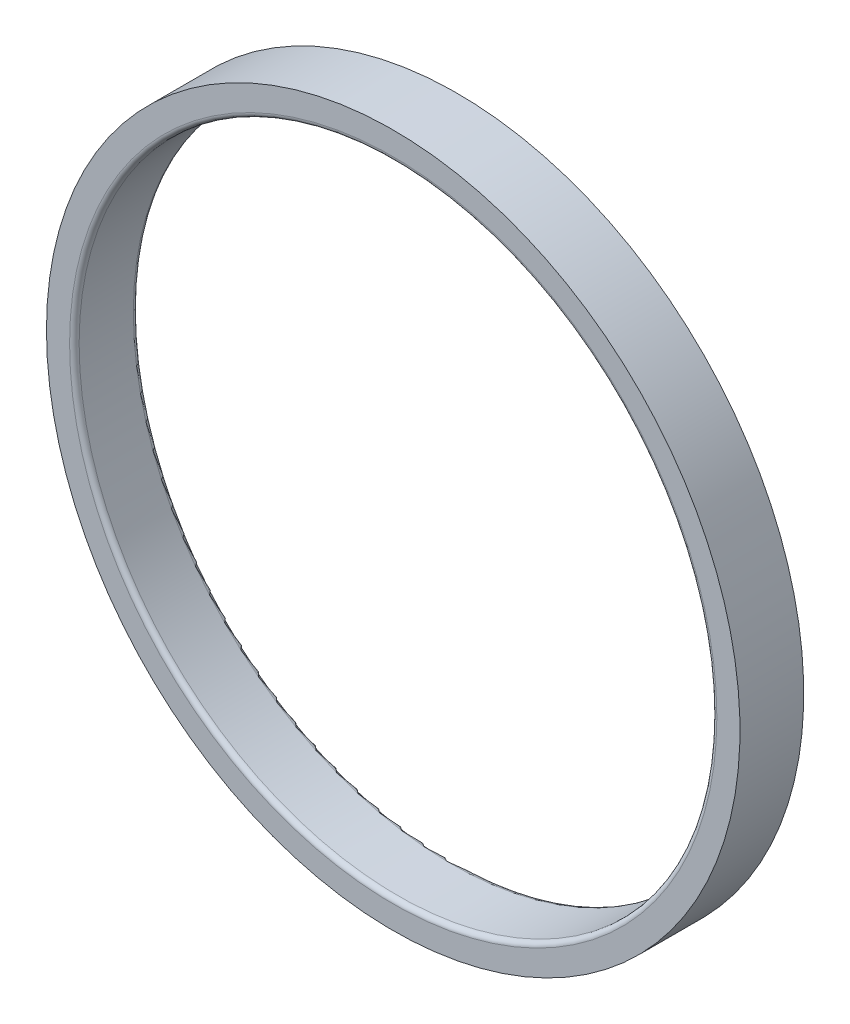
ISO-10303-21;
HEADER;
FILE_DESCRIPTION(('STEP AP214'),'2;1');
FILE_NAME('part.step','',(''),(''),'','','');
FILE_SCHEMA(('AUTOMOTIVE_DESIGN { 1 0 10303 214 1 1 1 1 }'));
ENDSEC;
DATA;
#1=APPLICATION_CONTEXT('core data for automotive mechanical design processes');
#2=APPLICATION_PROTOCOL_DEFINITION('international standard','automotive_design',2000,#1);
#3=PRODUCT_CONTEXT('',#1,'mechanical');
#4=PRODUCT('Part','Part','',(#3));
#5=PRODUCT_RELATED_PRODUCT_CATEGORY('part','',(#4));
#6=PRODUCT_DEFINITION_FORMATION('','',#4);
#7=PRODUCT_DEFINITION_CONTEXT('part definition',#1,'design');
#8=PRODUCT_DEFINITION('design','',#6,#7);
#9=PRODUCT_DEFINITION_SHAPE('','',#8);
#10=(LENGTH_UNIT() NAMED_UNIT(*) SI_UNIT(.MILLI.,.METRE.));
#11=(NAMED_UNIT(*) PLANE_ANGLE_UNIT() SI_UNIT($,.RADIAN.));
#12=(NAMED_UNIT(*) SI_UNIT($,.STERADIAN.) SOLID_ANGLE_UNIT());
#13=UNCERTAINTY_MEASURE_WITH_UNIT(LENGTH_MEASURE(1.E-05),#10,'distance_accuracy_value','');
#14=(GEOMETRIC_REPRESENTATION_CONTEXT(3) GLOBAL_UNCERTAINTY_ASSIGNED_CONTEXT((#13)) GLOBAL_UNIT_ASSIGNED_CONTEXT((#10,
#11,#12)) REPRESENTATION_CONTEXT('',''));
#15=CARTESIAN_POINT('',(0.,0.,0.));
#16=DIRECTION('',(0.,0.,1.));
#17=DIRECTION('',(1.,0.,0.));
#18=AXIS2_PLACEMENT_3D('',#15,#16,#17);
#19=CARTESIAN_POINT('',(0.,0.,63.1));
#20=DIRECTION('',(0.,0.,1.));
#21=DIRECTION('',(1.,0.,0.));
#22=AXIS2_PLACEMENT_3D('',#19,#20,#21);
#23=TOROIDAL_SURFACE('',#22,40.6,0.6);
#24=CARTESIAN_POINT('',(0.,0.,62.5));
#25=DIRECTION('',(0.,0.,-1.));
#26=DIRECTION('',(1.,0.,0.));
#27=AXIS2_PLACEMENT_3D('',#24,#25,#26);
#28=CIRCLE('',#27,40.6);
#29=CARTESIAN_POINT('',(-40.6,0.,62.5));
#30=VERTEX_POINT('',#29);
#31=EDGE_CURVE('E11',#30,#30,#28,.T.);
#32=ORIENTED_EDGE('',*,*,#31,.T.);
#33=CARTESIAN_POINT('',(-40.6,0.,63.1));
#34=DIRECTION('',(0.,-1.,0.));
#35=DIRECTION('',(-1.,0.,0.));
#36=AXIS2_PLACEMENT_3D('',#33,#34,#35);
#37=CIRCLE('',#36,0.6);
#38=CARTESIAN_POINT('',(-40.,0.,63.1));
#39=VERTEX_POINT('',#38);
#40=EDGE_CURVE('E27',#30,#39,#37,.T.);
#41=ORIENTED_EDGE('',*,*,#40,.T.);
#42=CARTESIAN_POINT('',(0.,0.,63.1));
#43=DIRECTION('',(0.,0.,1.));
#44=DIRECTION('',(1.,0.,0.));
#45=AXIS2_PLACEMENT_3D('',#42,#43,#44);
#46=CIRCLE('',#45,40.);
#47=EDGE_CURVE('E84',#39,#39,#46,.T.);
#48=ORIENTED_EDGE('',*,*,#47,.T.);
#49=ORIENTED_EDGE('',*,*,#40,.F.);
#50=EDGE_LOOP('',(#32,#41,#48,#49));
#51=FACE_BOUND('',#50,.T.);
#52=ADVANCED_FACE('F16',(#51),#23,.T.);
#53=CARTESIAN_POINT('',(0.,0.,66.5));
#54=DIRECTION('',(0.,0.,1.));
#55=DIRECTION('',(1.,0.,0.));
#56=AXIS2_PLACEMENT_3D('',#53,#54,#55);
#57=CYLINDRICAL_SURFACE('',#56,40.);
#58=CARTESIAN_POINT('',(0.,0.,69.9));
#59=DIRECTION('',(0.,0.,-1.));
#60=DIRECTION('',(1.,0.,0.));
#61=AXIS2_PLACEMENT_3D('',#58,#59,#60);
#62=CIRCLE('',#61,40.);
#63=CARTESIAN_POINT('',(-40.,0.,69.9));
#64=VERTEX_POINT('',#63);
#65=CARTESIAN_POINT('',(40.,0.,69.9));
#66=VERTEX_POINT('',#65);
#67=EDGE_CURVE('E90',#64,#66,#62,.T.);
#68=ORIENTED_EDGE('',*,*,#67,.F.);
#69=DIRECTION('',(0.,0.,-1.));
#70=VECTOR('',#69,1.);
#71=CARTESIAN_POINT('',(-40.,0.,66.5));
#72=LINE('',#71,#70);
#73=EDGE_CURVE('E77',#64,#39,#72,.T.);
#74=ORIENTED_EDGE('',*,*,#73,.T.);
#75=ORIENTED_EDGE('',*,*,#47,.F.);
#76=ORIENTED_EDGE('',*,*,#73,.F.);
#77=CARTESIAN_POINT('',(0.,0.,69.9));
#78=DIRECTION('',(0.,0.,-1.));
#79=DIRECTION('',(1.,0.,0.));
#80=AXIS2_PLACEMENT_3D('',#77,#78,#79);
#81=CIRCLE('',#80,40.);
#82=EDGE_CURVE('E103',#66,#64,#81,.T.);
#83=ORIENTED_EDGE('',*,*,#82,.F.);
#84=EDGE_LOOP('',(#68,#74,#75,#76,#83));
#85=FACE_BOUND('',#84,.T.);
#86=ADVANCED_FACE('F18',(#85),#57,.F.);
#87=CARTESIAN_POINT('',(0.,0.,62.5));
#88=DIRECTION('',(0.,0.,1.));
#89=DIRECTION('',(1.,0.,0.));
#90=AXIS2_PLACEMENT_3D('',#87,#88,#89);
#91=PLANE('',#90);
#92=CARTESIAN_POINT('',(0.,0.,62.5));
#93=DIRECTION('',(0.,0.,-1.));
#94=DIRECTION('',(1.,0.,0.));
#95=AXIS2_PLACEMENT_3D('',#92,#93,#94);
#96=CIRCLE('',#95,43.5);
#97=CARTESIAN_POINT('',(-43.5,0.,62.5));
#98=VERTEX_POINT('',#97);
#99=EDGE_CURVE('E72',#98,#98,#96,.T.);
#100=ORIENTED_EDGE('',*,*,#99,.T.);
#101=EDGE_LOOP('',(#100));
#102=FACE_BOUND('',#101,.T.);
#103=ORIENTED_EDGE('',*,*,#31,.F.);
#104=EDGE_LOOP('',(#103));
#105=FACE_BOUND('',#104,.T.);
#106=ADVANCED_FACE('F134',(#102,#105),#91,.F.);
#107=CARTESIAN_POINT('',(0.,0.,69.9));
#108=DIRECTION('',(0.,0.,-1.));
#109=DIRECTION('',(-1.,0.,0.));
#110=AXIS2_PLACEMENT_3D('',#107,#108,#109);
#111=TOROIDAL_SURFACE('',#110,40.6,0.6);
#112=CARTESIAN_POINT('',(0.,0.,70.5));
#113=DIRECTION('',(0.,0.,1.));
#114=DIRECTION('',(1.,0.,0.));
#115=AXIS2_PLACEMENT_3D('',#112,#113,#114);
#116=CIRCLE('',#115,40.6);
#117=CARTESIAN_POINT('',(-40.6,0.,70.5));
#118=VERTEX_POINT('',#117);
#119=CARTESIAN_POINT('',(40.6,0.,70.5));
#120=VERTEX_POINT('',#119);
#121=EDGE_CURVE('E20',#118,#120,#116,.T.);
#122=ORIENTED_EDGE('',*,*,#121,.T.);
#123=CARTESIAN_POINT('',(40.6,0.,69.9));
#124=DIRECTION('',(0.,-1.,0.));
#125=DIRECTION('',(1.,0.,0.));
#126=AXIS2_PLACEMENT_3D('',#123,#124,#125);
#127=CIRCLE('',#126,0.6);
#128=EDGE_CURVE('E87',#120,#66,#127,.T.);
#129=ORIENTED_EDGE('',*,*,#128,.T.);
#130=ORIENTED_EDGE('',*,*,#82,.T.);
#131=ORIENTED_EDGE('',*,*,#67,.T.);
#132=ORIENTED_EDGE('',*,*,#128,.F.);
#133=CARTESIAN_POINT('',(0.,0.,70.5));
#134=DIRECTION('',(0.,0.,1.));
#135=DIRECTION('',(1.,0.,0.));
#136=AXIS2_PLACEMENT_3D('',#133,#134,#135);
#137=CIRCLE('',#136,40.6);
#138=EDGE_CURVE('E91',#120,#118,#137,.T.);
#139=ORIENTED_EDGE('',*,*,#138,.T.);
#140=EDGE_LOOP('',(#122,#129,#130,#131,#132,#139));
#141=FACE_BOUND('',#140,.T.);
#142=ADVANCED_FACE('F125',(#141),#111,.T.);
#143=CARTESIAN_POINT('',(0.,0.,70.5));
#144=DIRECTION('',(0.,0.,1.));
#145=DIRECTION('',(1.,0.,0.));
#146=AXIS2_PLACEMENT_3D('',#143,#144,#145);
#147=PLANE('',#146);
#148=CARTESIAN_POINT('',(0.,0.,70.5));
#149=DIRECTION('',(0.,0.,1.));
#150=DIRECTION('',(1.,0.,0.));
#151=AXIS2_PLACEMENT_3D('',#148,#149,#150);
#152=CIRCLE('',#151,43.5);
#153=CARTESIAN_POINT('',(-43.5,0.,70.5));
#154=VERTEX_POINT('',#153);
#155=EDGE_CURVE('E57',#154,#154,#152,.T.);
#156=ORIENTED_EDGE('',*,*,#155,.T.);
#157=EDGE_LOOP('',(#156));
#158=FACE_BOUND('',#157,.T.);
#159=ORIENTED_EDGE('',*,*,#121,.F.);
#160=ORIENTED_EDGE('',*,*,#138,.F.);
#161=EDGE_LOOP('',(#159,#160));
#162=FACE_BOUND('',#161,.T.);
#163=ADVANCED_FACE('F126',(#158,#162),#147,.T.);
#164=CARTESIAN_POINT('',(0.,0.,66.5));
#165=DIRECTION('',(0.,0.,1.));
#166=DIRECTION('',(1.,0.,0.));
#167=AXIS2_PLACEMENT_3D('',#164,#165,#166);
#168=CYLINDRICAL_SURFACE('',#167,43.5);
#169=ORIENTED_EDGE('',*,*,#155,.F.);
#170=DIRECTION('',(0.,0.,-1.));
#171=VECTOR('',#170,1.);
#172=CARTESIAN_POINT('',(-43.5,0.,66.5));
#173=LINE('',#172,#171);
#174=EDGE_CURVE('E74',#154,#98,#173,.T.);
#175=ORIENTED_EDGE('',*,*,#174,.T.);
#176=ORIENTED_EDGE('',*,*,#99,.F.);
#177=ORIENTED_EDGE('',*,*,#174,.F.);
#178=EDGE_LOOP('',(#169,#175,#176,#177));
#179=FACE_BOUND('',#178,.T.);
#180=ADVANCED_FACE('F73',(#179),#168,.T.);
#181=CLOSED_SHELL('',(#52,#86,#106,#142,#163,#180));
#182=MANIFOLD_SOLID_BREP('B1',#181);
#183=ADVANCED_BREP_SHAPE_REPRESENTATION('',(#18,#182),#14);
#184=SHAPE_DEFINITION_REPRESENTATION(#9,#183);
ENDSEC;
END-ISO-10303-21;
